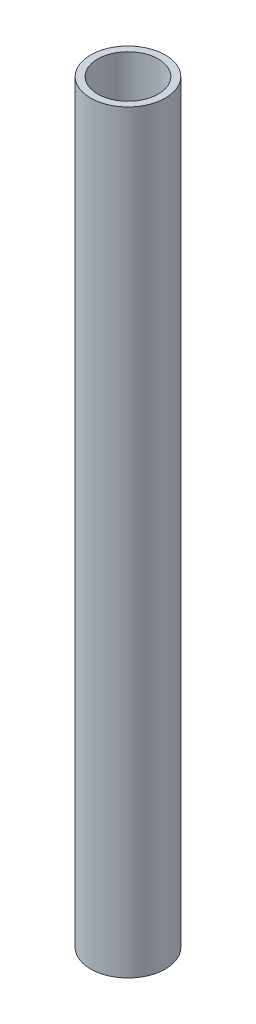
ISO-10303-21;
HEADER;
FILE_DESCRIPTION(('STEP AP214'),'2;1');
FILE_NAME('part.step','',(''),(''),'','','');
FILE_SCHEMA(('AUTOMOTIVE_DESIGN { 1 0 10303 214 1 1 1 1 }'));
ENDSEC;
DATA;
#1=APPLICATION_CONTEXT('core data for automotive mechanical design processes');
#2=APPLICATION_PROTOCOL_DEFINITION('international standard','automotive_design',2000,#1);
#3=PRODUCT_CONTEXT('',#1,'mechanical');
#4=PRODUCT('Part','Part','',(#3));
#5=PRODUCT_RELATED_PRODUCT_CATEGORY('part','',(#4));
#6=PRODUCT_DEFINITION_FORMATION('','',#4);
#7=PRODUCT_DEFINITION_CONTEXT('part definition',#1,'design');
#8=PRODUCT_DEFINITION('design','',#6,#7);
#9=PRODUCT_DEFINITION_SHAPE('','',#8);
#10=(LENGTH_UNIT() NAMED_UNIT(*) SI_UNIT(.MILLI.,.METRE.));
#11=(NAMED_UNIT(*) PLANE_ANGLE_UNIT() SI_UNIT($,.RADIAN.));
#12=(NAMED_UNIT(*) SI_UNIT($,.STERADIAN.) SOLID_ANGLE_UNIT());
#13=UNCERTAINTY_MEASURE_WITH_UNIT(LENGTH_MEASURE(1.E-05),#10,'distance_accuracy_value','');
#14=(GEOMETRIC_REPRESENTATION_CONTEXT(3) GLOBAL_UNCERTAINTY_ASSIGNED_CONTEXT((#13)) GLOBAL_UNIT_ASSIGNED_CONTEXT((#10,
#11,#12)) REPRESENTATION_CONTEXT('',''));
#15=CARTESIAN_POINT('',(0.,0.,0.));
#16=DIRECTION('',(0.,0.,1.));
#17=DIRECTION('',(1.,0.,0.));
#18=AXIS2_PLACEMENT_3D('',#15,#16,#17);
#19=CARTESIAN_POINT('',(2.45914399954472E-11,215.,1.50000000000001));
#20=DIRECTION('',(0.,1.,0.));
#21=DIRECTION('',(0.,0.,1.));
#22=AXIS2_PLACEMENT_3D('',#19,#20,#21);
#23=PLANE('',#22);
#24=CARTESIAN_POINT('',(2.45914399954472E-11,215.,1.50000000000001));
#25=DIRECTION('',(0.,1.,0.));
#26=DIRECTION('',(0.,0.,1.));
#27=AXIS2_PLACEMENT_3D('',#24,#25,#26);
#28=CIRCLE('',#27,10.65);
#29=CARTESIAN_POINT('',(2.45914399954472E-11,215.,12.15));
#30=VERTEX_POINT('',#29);
#31=EDGE_CURVE('E10',#30,#30,#28,.T.);
#32=ORIENTED_EDGE('',*,*,#31,.T.);
#33=EDGE_LOOP('',(#32));
#34=FACE_BOUND('',#33,.T.);
#35=CARTESIAN_POINT('',(2.45914399954472E-11,215.,1.50000000000001));
#36=DIRECTION('',(0.,1.,0.));
#37=DIRECTION('',(0.,0.,1.));
#38=AXIS2_PLACEMENT_3D('',#35,#36,#37);
#39=CIRCLE('',#38,8.65);
#40=CARTESIAN_POINT('',(2.45914399954472E-11,215.,10.15));
#41=VERTEX_POINT('',#40);
#42=EDGE_CURVE('E44',#41,#41,#39,.T.);
#43=ORIENTED_EDGE('',*,*,#42,.F.);
#44=EDGE_LOOP('',(#43));
#45=FACE_BOUND('',#44,.T.);
#46=ADVANCED_FACE('F33',(#34,#45),#23,.T.);
#47=CARTESIAN_POINT('',(2.45914399954472E-11,0.,1.50000000000001));
#48=DIRECTION('',(0.,1.,0.));
#49=DIRECTION('',(0.,0.,1.));
#50=AXIS2_PLACEMENT_3D('',#47,#48,#49);
#51=PLANE('',#50);
#52=CARTESIAN_POINT('',(2.45914399954472E-11,0.,1.50000000000001));
#53=DIRECTION('',(0.,1.,0.));
#54=DIRECTION('',(0.,0.,1.));
#55=AXIS2_PLACEMENT_3D('',#52,#53,#54);
#56=CIRCLE('',#55,10.65);
#57=CARTESIAN_POINT('',(2.45914399954472E-11,0.,12.15));
#58=VERTEX_POINT('',#57);
#59=EDGE_CURVE('E37',#58,#58,#56,.T.);
#60=ORIENTED_EDGE('',*,*,#59,.F.);
#61=EDGE_LOOP('',(#60));
#62=FACE_BOUND('',#61,.T.);
#63=CARTESIAN_POINT('',(2.45914399954472E-11,0.,1.50000000000001));
#64=DIRECTION('',(0.,1.,0.));
#65=DIRECTION('',(0.,0.,1.));
#66=AXIS2_PLACEMENT_3D('',#63,#64,#65);
#67=CIRCLE('',#66,8.65);
#68=CARTESIAN_POINT('',(2.45914399954472E-11,0.,10.15));
#69=VERTEX_POINT('',#68);
#70=EDGE_CURVE('E46',#69,#69,#67,.T.);
#71=ORIENTED_EDGE('',*,*,#70,.T.);
#72=EDGE_LOOP('',(#71));
#73=FACE_BOUND('',#72,.T.);
#74=ADVANCED_FACE('F56',(#62,#73),#51,.F.);
#75=CARTESIAN_POINT('',(2.45914399954472E-11,215.,1.50000000000001));
#76=DIRECTION('',(0.,-1.,0.));
#77=DIRECTION('',(0.,0.,-1.));
#78=AXIS2_PLACEMENT_3D('',#75,#76,#77);
#79=CYLINDRICAL_SURFACE('',#78,10.65);
#80=ORIENTED_EDGE('',*,*,#31,.F.);
#81=EDGE_LOOP('',(#80));
#82=FACE_BOUND('',#81,.T.);
#83=ORIENTED_EDGE('',*,*,#59,.T.);
#84=EDGE_LOOP('',(#83));
#85=FACE_BOUND('',#84,.T.);
#86=ADVANCED_FACE('F35',(#82,#85),#79,.T.);
#87=CARTESIAN_POINT('',(2.45914399954472E-11,215.,1.50000000000001));
#88=DIRECTION('',(0.,-1.,0.));
#89=DIRECTION('',(0.,0.,-1.));
#90=AXIS2_PLACEMENT_3D('',#87,#88,#89);
#91=CYLINDRICAL_SURFACE('',#90,8.65);
#92=ORIENTED_EDGE('',*,*,#42,.T.);
#93=EDGE_LOOP('',(#92));
#94=FACE_BOUND('',#93,.T.);
#95=ORIENTED_EDGE('',*,*,#70,.F.);
#96=EDGE_LOOP('',(#95));
#97=FACE_BOUND('',#96,.T.);
#98=ADVANCED_FACE('F52',(#94,#97),#91,.F.);
#99=CLOSED_SHELL('',(#46,#74,#86,#98));
#100=MANIFOLD_SOLID_BREP('B2',#99);
#101=ADVANCED_BREP_SHAPE_REPRESENTATION('',(#18,#100),#14);
#102=SHAPE_DEFINITION_REPRESENTATION(#9,#101);
ENDSEC;
END-ISO-10303-21;
